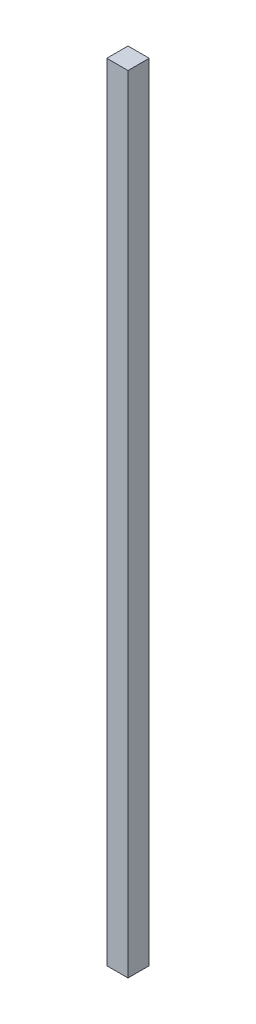
ISO-10303-21;
HEADER;
FILE_DESCRIPTION(('STEP AP214'),'2;1');
FILE_NAME('part.step','',(''),(''),'','','');
FILE_SCHEMA(('AUTOMOTIVE_DESIGN { 1 0 10303 214 1 1 1 1 }'));
ENDSEC;
DATA;
#1=APPLICATION_CONTEXT('core data for automotive mechanical design processes');
#2=APPLICATION_PROTOCOL_DEFINITION('international standard','automotive_design',2000,#1);
#3=PRODUCT_CONTEXT('',#1,'mechanical');
#4=PRODUCT('Part','Part','',(#3));
#5=PRODUCT_RELATED_PRODUCT_CATEGORY('part','',(#4));
#6=PRODUCT_DEFINITION_FORMATION('','',#4);
#7=PRODUCT_DEFINITION_CONTEXT('part definition',#1,'design');
#8=PRODUCT_DEFINITION('design','',#6,#7);
#9=PRODUCT_DEFINITION_SHAPE('','',#8);
#10=(LENGTH_UNIT() NAMED_UNIT(*) SI_UNIT(.MILLI.,.METRE.));
#11=(NAMED_UNIT(*) PLANE_ANGLE_UNIT() SI_UNIT($,.RADIAN.));
#12=(NAMED_UNIT(*) SI_UNIT($,.STERADIAN.) SOLID_ANGLE_UNIT());
#13=UNCERTAINTY_MEASURE_WITH_UNIT(LENGTH_MEASURE(1.E-05),#10,'distance_accuracy_value','');
#14=(GEOMETRIC_REPRESENTATION_CONTEXT(3) GLOBAL_UNCERTAINTY_ASSIGNED_CONTEXT((#13)) GLOBAL_UNIT_ASSIGNED_CONTEXT((#10,
#11,#12)) REPRESENTATION_CONTEXT('',''));
#15=CARTESIAN_POINT('',(0.,0.,0.));
#16=DIRECTION('',(0.,0.,1.));
#17=DIRECTION('',(1.,0.,0.));
#18=AXIS2_PLACEMENT_3D('',#15,#16,#17);
#19=CARTESIAN_POINT('',(3.175,234.95,3.175));
#20=DIRECTION('',(-1.,0.,0.));
#21=DIRECTION('',(0.,0.,1.));
#22=AXIS2_PLACEMENT_3D('',#19,#20,#21);
#23=PLANE('',#22);
#24=DIRECTION('',(0.,0.,-1.));
#25=VECTOR('',#24,1.);
#26=CARTESIAN_POINT('',(3.175,0.,3.175));
#27=LINE('',#26,#25);
#28=CARTESIAN_POINT('',(3.175,0.,3.175));
#29=VERTEX_POINT('',#28);
#30=CARTESIAN_POINT('',(3.175,0.,-3.175));
#31=VERTEX_POINT('',#30);
#32=EDGE_CURVE('E81',#29,#31,#27,.T.);
#33=ORIENTED_EDGE('',*,*,#32,.T.);
#34=DIRECTION('',(0.,-1.,0.));
#35=VECTOR('',#34,1.);
#36=CARTESIAN_POINT('',(3.175,234.95,-3.175));
#37=LINE('',#36,#35);
#38=CARTESIAN_POINT('',(3.175,234.95,-3.175));
#39=VERTEX_POINT('',#38);
#40=EDGE_CURVE('E10',#39,#31,#37,.T.);
#41=ORIENTED_EDGE('',*,*,#40,.F.);
#42=DIRECTION('',(0.,0.,-1.));
#43=VECTOR('',#42,1.);
#44=CARTESIAN_POINT('',(3.175,234.95,3.175));
#45=LINE('',#44,#43);
#46=CARTESIAN_POINT('',(3.175,234.95,3.175));
#47=VERTEX_POINT('',#46);
#48=EDGE_CURVE('E67',#47,#39,#45,.T.);
#49=ORIENTED_EDGE('',*,*,#48,.F.);
#50=DIRECTION('',(0.,-1.,0.));
#51=VECTOR('',#50,1.);
#52=CARTESIAN_POINT('',(3.175,234.95,3.175));
#53=LINE('',#52,#51);
#54=EDGE_CURVE('E75',#47,#29,#53,.T.);
#55=ORIENTED_EDGE('',*,*,#54,.T.);
#56=EDGE_LOOP('',(#33,#41,#49,#55));
#57=FACE_BOUND('',#56,.T.);
#58=ADVANCED_FACE('F16',(#57),#23,.F.);
#59=CARTESIAN_POINT('',(3.175,234.95,-3.175));
#60=DIRECTION('',(0.,0.,1.));
#61=DIRECTION('',(1.,0.,0.));
#62=AXIS2_PLACEMENT_3D('',#59,#60,#61);
#63=PLANE('',#62);
#64=DIRECTION('',(-1.,0.,0.));
#65=VECTOR('',#64,1.);
#66=CARTESIAN_POINT('',(3.175,0.,-3.175));
#67=LINE('',#66,#65);
#68=CARTESIAN_POINT('',(-3.175,0.,-3.175));
#69=VERTEX_POINT('',#68);
#70=EDGE_CURVE('E71',#31,#69,#67,.T.);
#71=ORIENTED_EDGE('',*,*,#70,.T.);
#72=DIRECTION('',(0.,-1.,0.));
#73=VECTOR('',#72,1.);
#74=CARTESIAN_POINT('',(-3.175,234.95,-3.175));
#75=LINE('',#74,#73);
#76=CARTESIAN_POINT('',(-3.175,234.95,-3.175));
#77=VERTEX_POINT('',#76);
#78=EDGE_CURVE('E24',#77,#69,#75,.T.);
#79=ORIENTED_EDGE('',*,*,#78,.F.);
#80=DIRECTION('',(-1.,0.,0.));
#81=VECTOR('',#80,1.);
#82=CARTESIAN_POINT('',(3.175,234.95,-3.175));
#83=LINE('',#82,#81);
#84=EDGE_CURVE('E62',#39,#77,#83,.T.);
#85=ORIENTED_EDGE('',*,*,#84,.F.);
#86=ORIENTED_EDGE('',*,*,#40,.T.);
#87=EDGE_LOOP('',(#71,#79,#85,#86));
#88=FACE_BOUND('',#87,.T.);
#89=ADVANCED_FACE('F70',(#88),#63,.F.);
#90=CARTESIAN_POINT('',(-3.175,234.95,-3.175));
#91=DIRECTION('',(1.,0.,0.));
#92=DIRECTION('',(0.,0.,-1.));
#93=AXIS2_PLACEMENT_3D('',#90,#91,#92);
#94=PLANE('',#93);
#95=DIRECTION('',(0.,0.,1.));
#96=VECTOR('',#95,1.);
#97=CARTESIAN_POINT('',(-3.175,0.,-3.175));
#98=LINE('',#97,#96);
#99=CARTESIAN_POINT('',(-3.175,0.,3.175));
#100=VERTEX_POINT('',#99);
#101=EDGE_CURVE('E49',#69,#100,#98,.T.);
#102=ORIENTED_EDGE('',*,*,#101,.T.);
#103=DIRECTION('',(0.,-1.,0.));
#104=VECTOR('',#103,1.);
#105=CARTESIAN_POINT('',(-3.175,234.95,3.175));
#106=LINE('',#105,#104);
#107=CARTESIAN_POINT('',(-3.175,234.95,3.175));
#108=VERTEX_POINT('',#107);
#109=EDGE_CURVE('E72',#108,#100,#106,.T.);
#110=ORIENTED_EDGE('',*,*,#109,.F.);
#111=DIRECTION('',(0.,0.,1.));
#112=VECTOR('',#111,1.);
#113=CARTESIAN_POINT('',(-3.175,234.95,-3.175));
#114=LINE('',#113,#112);
#115=EDGE_CURVE('E65',#77,#108,#114,.T.);
#116=ORIENTED_EDGE('',*,*,#115,.F.);
#117=ORIENTED_EDGE('',*,*,#78,.T.);
#118=EDGE_LOOP('',(#102,#110,#116,#117));
#119=FACE_BOUND('',#118,.T.);
#120=ADVANCED_FACE('F73',(#119),#94,.F.);
#121=CARTESIAN_POINT('',(-3.175,234.95,3.175));
#122=DIRECTION('',(0.,0.,-1.));
#123=DIRECTION('',(-1.,0.,0.));
#124=AXIS2_PLACEMENT_3D('',#121,#122,#123);
#125=PLANE('',#124);
#126=DIRECTION('',(1.,0.,0.));
#127=VECTOR('',#126,1.);
#128=CARTESIAN_POINT('',(-3.175,0.,3.175));
#129=LINE('',#128,#127);
#130=EDGE_CURVE('E55',#100,#29,#129,.T.);
#131=ORIENTED_EDGE('',*,*,#130,.T.);
#132=ORIENTED_EDGE('',*,*,#54,.F.);
#133=DIRECTION('',(1.,0.,0.));
#134=VECTOR('',#133,1.);
#135=CARTESIAN_POINT('',(-3.175,234.95,3.175));
#136=LINE('',#135,#134);
#137=EDGE_CURVE('E32',#108,#47,#136,.T.);
#138=ORIENTED_EDGE('',*,*,#137,.F.);
#139=ORIENTED_EDGE('',*,*,#109,.T.);
#140=EDGE_LOOP('',(#131,#132,#138,#139));
#141=FACE_BOUND('',#140,.T.);
#142=ADVANCED_FACE('F90',(#141),#125,.F.);
#143=CARTESIAN_POINT('',(0.,234.95,0.));
#144=DIRECTION('',(0.,1.,0.));
#145=DIRECTION('',(0.,0.,1.));
#146=AXIS2_PLACEMENT_3D('',#143,#144,#145);
#147=PLANE('',#146);
#148=ORIENTED_EDGE('',*,*,#48,.T.);
#149=ORIENTED_EDGE('',*,*,#84,.T.);
#150=ORIENTED_EDGE('',*,*,#115,.T.);
#151=ORIENTED_EDGE('',*,*,#137,.T.);
#152=EDGE_LOOP('',(#148,#149,#150,#151));
#153=FACE_BOUND('',#152,.T.);
#154=ADVANCED_FACE('F63',(#153),#147,.T.);
#155=CARTESIAN_POINT('',(0.,0.,0.));
#156=DIRECTION('',(0.,1.,0.));
#157=DIRECTION('',(0.,0.,1.));
#158=AXIS2_PLACEMENT_3D('',#155,#156,#157);
#159=PLANE('',#158);
#160=ORIENTED_EDGE('',*,*,#32,.F.);
#161=ORIENTED_EDGE('',*,*,#130,.F.);
#162=ORIENTED_EDGE('',*,*,#101,.F.);
#163=ORIENTED_EDGE('',*,*,#70,.F.);
#164=EDGE_LOOP('',(#160,#161,#162,#163));
#165=FACE_BOUND('',#164,.T.);
#166=ADVANCED_FACE('F93',(#165),#159,.F.);
#167=CLOSED_SHELL('',(#58,#89,#120,#142,#154,#166));
#168=MANIFOLD_SOLID_BREP('B1',#167);
#169=ADVANCED_BREP_SHAPE_REPRESENTATION('',(#18,#168),#14);
#170=SHAPE_DEFINITION_REPRESENTATION(#9,#169);
ENDSEC;
END-ISO-10303-21;
